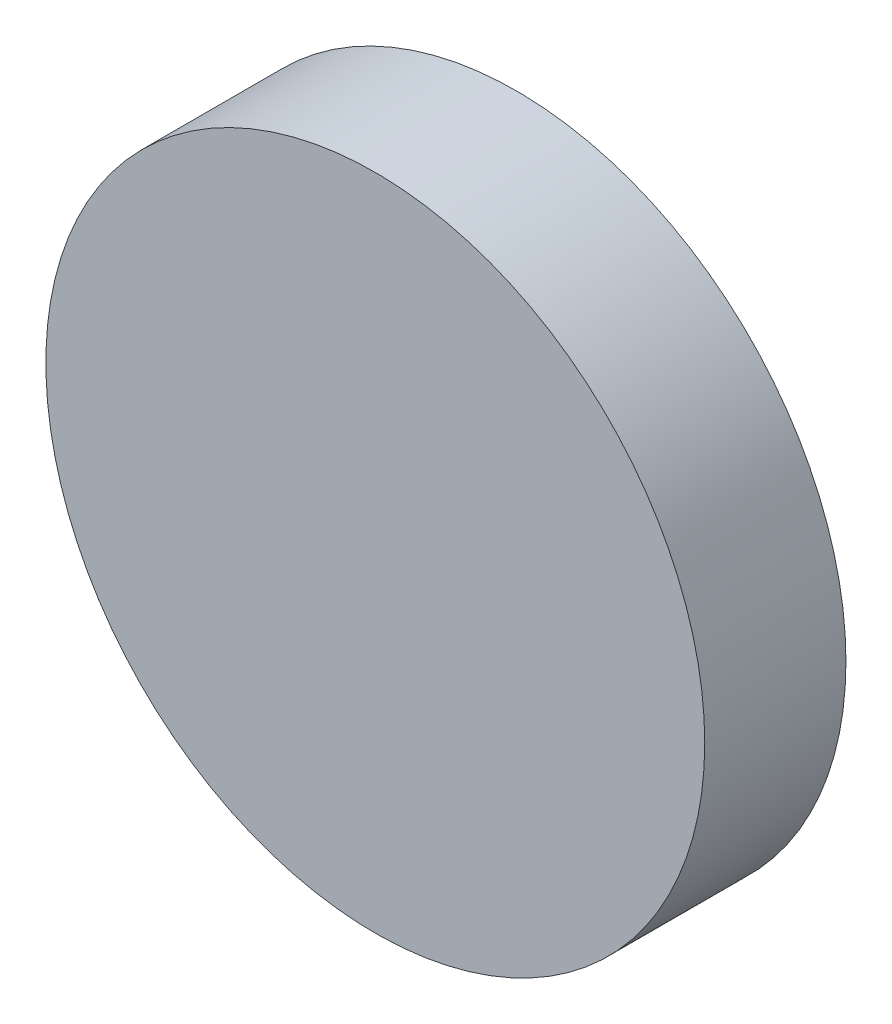
ISO-10303-21;
HEADER;
FILE_DESCRIPTION(('STEP AP214'),'2;1');
FILE_NAME('part.step','',(''),(''),'','','');
FILE_SCHEMA(('AUTOMOTIVE_DESIGN { 1 0 10303 214 1 1 1 1 }'));
ENDSEC;
DATA;
#1=APPLICATION_CONTEXT('core data for automotive mechanical design processes');
#2=APPLICATION_PROTOCOL_DEFINITION('international standard','automotive_design',2000,#1);
#3=PRODUCT_CONTEXT('',#1,'mechanical');
#4=PRODUCT('Part','Part','',(#3));
#5=PRODUCT_RELATED_PRODUCT_CATEGORY('part','',(#4));
#6=PRODUCT_DEFINITION_FORMATION('','',#4);
#7=PRODUCT_DEFINITION_CONTEXT('part definition',#1,'design');
#8=PRODUCT_DEFINITION('design','',#6,#7);
#9=PRODUCT_DEFINITION_SHAPE('','',#8);
#10=(LENGTH_UNIT() NAMED_UNIT(*) SI_UNIT(.MILLI.,.METRE.));
#11=(NAMED_UNIT(*) PLANE_ANGLE_UNIT() SI_UNIT($,.RADIAN.));
#12=(NAMED_UNIT(*) SI_UNIT($,.STERADIAN.) SOLID_ANGLE_UNIT());
#13=UNCERTAINTY_MEASURE_WITH_UNIT(LENGTH_MEASURE(1.E-05),#10,'distance_accuracy_value','');
#14=(GEOMETRIC_REPRESENTATION_CONTEXT(3) GLOBAL_UNCERTAINTY_ASSIGNED_CONTEXT((#13)) GLOBAL_UNIT_ASSIGNED_CONTEXT((#10,
#11,#12)) REPRESENTATION_CONTEXT('',''));
#15=CARTESIAN_POINT('',(0.,0.,0.));
#16=DIRECTION('',(0.,0.,1.));
#17=DIRECTION('',(1.,0.,0.));
#18=AXIS2_PLACEMENT_3D('',#15,#16,#17);
#19=CARTESIAN_POINT('',(0.,0.,60.));
#20=DIRECTION('',(0.,0.,-1.));
#21=DIRECTION('',(-1.,0.,0.));
#22=AXIS2_PLACEMENT_3D('',#19,#20,#21);
#23=CYLINDRICAL_SURFACE('',#22,140.);
#24=CARTESIAN_POINT('',(0.,0.,60.));
#25=DIRECTION('',(0.,0.,1.));
#26=DIRECTION('',(1.,0.,0.));
#27=AXIS2_PLACEMENT_3D('',#24,#25,#26);
#28=CIRCLE('',#27,140.);
#29=CARTESIAN_POINT('',(140.,0.,60.));
#30=VERTEX_POINT('',#29);
#31=EDGE_CURVE('E10',#30,#30,#28,.T.);
#32=ORIENTED_EDGE('',*,*,#31,.F.);
#33=EDGE_LOOP('',(#32));
#34=FACE_BOUND('',#33,.T.);
#35=CARTESIAN_POINT('',(0.,0.,0.));
#36=DIRECTION('',(0.,0.,1.));
#37=DIRECTION('',(1.,0.,0.));
#38=AXIS2_PLACEMENT_3D('',#35,#36,#37);
#39=CIRCLE('',#38,140.);
#40=CARTESIAN_POINT('',(140.,0.,0.));
#41=VERTEX_POINT('',#40);
#42=EDGE_CURVE('E34',#41,#41,#39,.T.);
#43=ORIENTED_EDGE('',*,*,#42,.T.);
#44=EDGE_LOOP('',(#43));
#45=FACE_BOUND('',#44,.T.);
#46=ADVANCED_FACE('F31',(#34,#45),#23,.T.);
#47=CARTESIAN_POINT('',(0.,0.,60.));
#48=DIRECTION('',(0.,0.,1.));
#49=DIRECTION('',(1.,0.,0.));
#50=AXIS2_PLACEMENT_3D('',#47,#48,#49);
#51=PLANE('',#50);
#52=ORIENTED_EDGE('',*,*,#31,.T.);
#53=EDGE_LOOP('',(#52));
#54=FACE_BOUND('',#53,.T.);
#55=ADVANCED_FACE('F46',(#54),#51,.T.);
#56=CARTESIAN_POINT('',(0.,0.,0.));
#57=DIRECTION('',(0.,0.,1.));
#58=DIRECTION('',(1.,0.,0.));
#59=AXIS2_PLACEMENT_3D('',#56,#57,#58);
#60=PLANE('',#59);
#61=ORIENTED_EDGE('',*,*,#42,.F.);
#62=EDGE_LOOP('',(#61));
#63=FACE_BOUND('',#62,.T.);
#64=ADVANCED_FACE('F44',(#63),#60,.F.);
#65=CLOSED_SHELL('',(#46,#55,#64));
#66=MANIFOLD_SOLID_BREP('B2',#65);
#67=ADVANCED_BREP_SHAPE_REPRESENTATION('',(#18,#66),#14);
#68=SHAPE_DEFINITION_REPRESENTATION(#9,#67);
ENDSEC;
END-ISO-10303-21;
